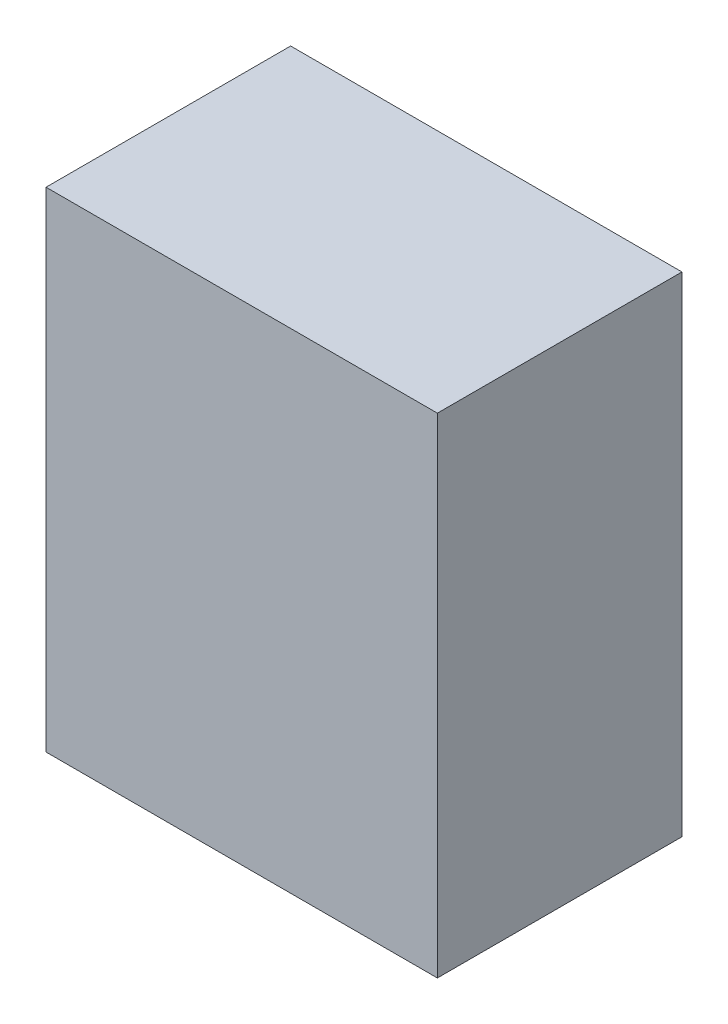
ISO-10303-21;
HEADER;
FILE_DESCRIPTION(('STEP AP214'),'2;1');
FILE_NAME('part.step','',(''),(''),'','','');
FILE_SCHEMA(('AUTOMOTIVE_DESIGN { 1 0 10303 214 1 1 1 1 }'));
ENDSEC;
DATA;
#1=APPLICATION_CONTEXT('core data for automotive mechanical design processes');
#2=APPLICATION_PROTOCOL_DEFINITION('international standard','automotive_design',2000,#1);
#3=PRODUCT_CONTEXT('',#1,'mechanical');
#4=PRODUCT('Part','Part','',(#3));
#5=PRODUCT_RELATED_PRODUCT_CATEGORY('part','',(#4));
#6=PRODUCT_DEFINITION_FORMATION('','',#4);
#7=PRODUCT_DEFINITION_CONTEXT('part definition',#1,'design');
#8=PRODUCT_DEFINITION('design','',#6,#7);
#9=PRODUCT_DEFINITION_SHAPE('','',#8);
#10=(LENGTH_UNIT() NAMED_UNIT(*) SI_UNIT(.MILLI.,.METRE.));
#11=(NAMED_UNIT(*) PLANE_ANGLE_UNIT() SI_UNIT($,.RADIAN.));
#12=(NAMED_UNIT(*) SI_UNIT($,.STERADIAN.) SOLID_ANGLE_UNIT());
#13=UNCERTAINTY_MEASURE_WITH_UNIT(LENGTH_MEASURE(1.E-05),#10,'distance_accuracy_value','');
#14=(GEOMETRIC_REPRESENTATION_CONTEXT(3) GLOBAL_UNCERTAINTY_ASSIGNED_CONTEXT((#13)) GLOBAL_UNIT_ASSIGNED_CONTEXT((#10,
#11,#12)) REPRESENTATION_CONTEXT('',''));
#15=CARTESIAN_POINT('',(0.,0.,0.));
#16=DIRECTION('',(0.,0.,1.));
#17=DIRECTION('',(1.,0.,0.));
#18=AXIS2_PLACEMENT_3D('',#15,#16,#17);
#19=CARTESIAN_POINT('',(0.80000348,1.00000308,1.00000054));
#20=DIRECTION('',(0.,0.,-1.));
#21=DIRECTION('',(0.,-1.,0.));
#22=AXIS2_PLACEMENT_3D('',#19,#20,#21);
#23=PLANE('',#22);
#24=DIRECTION('',(-0.99999999999496,-3.17499123419987E-06,0.));
#25=VECTOR('',#24,1.);
#26=CARTESIAN_POINT('',(0.80000348,1.00000308,1.00000054));
#27=LINE('',#26,#25);
#28=CARTESIAN_POINT('',(0.80000348,1.00000308,1.00000054));
#29=VERTEX_POINT('',#28);
#30=CARTESIAN_POINT('',(-0.80000094,0.999998,1.00000054));
#31=VERTEX_POINT('',#30);
#32=EDGE_CURVE('E83',#29,#31,#27,.T.);
#33=ORIENTED_EDGE('',*,*,#32,.T.);
#34=DIRECTION('',(0.,-1.,0.));
#35=VECTOR('',#34,1.);
#36=CARTESIAN_POINT('',(-0.80000094,0.999998,1.00000054));
#37=LINE('',#36,#35);
#38=CARTESIAN_POINT('',(-0.80000094,-1.00000054,1.00000054));
#39=VERTEX_POINT('',#38);
#40=EDGE_CURVE('E101',#31,#39,#37,.T.);
#41=ORIENTED_EDGE('',*,*,#40,.T.);
#42=DIRECTION('',(0.99999999999874,1.58749561266459E-06,0.));
#43=VECTOR('',#42,1.);
#44=CARTESIAN_POINT('',(-0.80000094,-1.00000054,1.00000054));
#45=LINE('',#44,#43);
#46=CARTESIAN_POINT('',(0.80000348,-0.999998,1.00000054));
#47=VERTEX_POINT('',#46);
#48=EDGE_CURVE('E76',#39,#47,#45,.T.);
#49=ORIENTED_EDGE('',*,*,#48,.T.);
#50=DIRECTION('',(0.,1.,0.));
#51=VECTOR('',#50,1.);
#52=CARTESIAN_POINT('',(0.80000348,-0.999998,1.00000054));
#53=LINE('',#52,#51);
#54=EDGE_CURVE('E11',#47,#29,#53,.T.);
#55=ORIENTED_EDGE('',*,*,#54,.T.);
#56=EDGE_LOOP('',(#33,#41,#49,#55));
#57=FACE_BOUND('',#56,.T.);
#58=ADVANCED_FACE('F17',(#57),#23,.F.);
#59=CARTESIAN_POINT('',(0.80000348,1.00000308,0.));
#60=DIRECTION('',(0.,0.,-1.));
#61=DIRECTION('',(0.,-1.,0.));
#62=AXIS2_PLACEMENT_3D('',#59,#60,#61);
#63=PLANE('',#62);
#64=DIRECTION('',(0.,1.,0.));
#65=VECTOR('',#64,1.);
#66=CARTESIAN_POINT('',(0.80000348,-0.999998,0.));
#67=LINE('',#66,#65);
#68=CARTESIAN_POINT('',(0.80000348,-0.999998,0.));
#69=VERTEX_POINT('',#68);
#70=CARTESIAN_POINT('',(0.80000348,1.00000308,0.));
#71=VERTEX_POINT('',#70);
#72=EDGE_CURVE('E21',#69,#71,#67,.T.);
#73=ORIENTED_EDGE('',*,*,#72,.F.);
#74=DIRECTION('',(0.99999999999874,1.58749561266459E-06,0.));
#75=VECTOR('',#74,1.);
#76=CARTESIAN_POINT('',(-0.80000094,-1.00000054,0.));
#77=LINE('',#76,#75);
#78=CARTESIAN_POINT('',(-0.80000094,-1.00000054,0.));
#79=VERTEX_POINT('',#78);
#80=EDGE_CURVE('E98',#79,#69,#77,.T.);
#81=ORIENTED_EDGE('',*,*,#80,.F.);
#82=DIRECTION('',(0.,-1.,0.));
#83=VECTOR('',#82,1.);
#84=CARTESIAN_POINT('',(-0.80000094,0.999998,0.));
#85=LINE('',#84,#83);
#86=CARTESIAN_POINT('',(-0.80000094,0.999998,0.));
#87=VERTEX_POINT('',#86);
#88=EDGE_CURVE('E85',#87,#79,#85,.T.);
#89=ORIENTED_EDGE('',*,*,#88,.F.);
#90=DIRECTION('',(-0.99999999999496,-3.17499123419987E-06,0.));
#91=VECTOR('',#90,1.);
#92=CARTESIAN_POINT('',(0.80000348,1.00000308,0.));
#93=LINE('',#92,#91);
#94=EDGE_CURVE('E81',#71,#87,#93,.T.);
#95=ORIENTED_EDGE('',*,*,#94,.F.);
#96=EDGE_LOOP('',(#73,#81,#89,#95));
#97=FACE_BOUND('',#96,.T.);
#98=ADVANCED_FACE('F19',(#97),#63,.T.);
#99=CARTESIAN_POINT('',(0.80000348,-0.999998,0.));
#100=DIRECTION('',(-1.,0.,0.));
#101=DIRECTION('',(0.,0.,1.));
#102=AXIS2_PLACEMENT_3D('',#99,#100,#101);
#103=PLANE('',#102);
#104=ORIENTED_EDGE('',*,*,#72,.T.);
#105=DIRECTION('',(0.,0.,1.));
#106=VECTOR('',#105,1.);
#107=CARTESIAN_POINT('',(0.80000348,1.00000308,0.));
#108=LINE('',#107,#106);
#109=EDGE_CURVE('E70',#71,#29,#108,.T.);
#110=ORIENTED_EDGE('',*,*,#109,.T.);
#111=ORIENTED_EDGE('',*,*,#54,.F.);
#112=DIRECTION('',(0.,0.,1.));
#113=VECTOR('',#112,1.);
#114=CARTESIAN_POINT('',(0.80000348,-0.999998,0.));
#115=LINE('',#114,#113);
#116=EDGE_CURVE('E73',#69,#47,#115,.T.);
#117=ORIENTED_EDGE('',*,*,#116,.F.);
#118=EDGE_LOOP('',(#104,#110,#111,#117));
#119=FACE_BOUND('',#118,.T.);
#120=ADVANCED_FACE('F69',(#119),#103,.F.);
#121=CARTESIAN_POINT('',(-0.80000094,-1.00000054,0.));
#122=DIRECTION('',(-1.58749561266459E-06,0.99999999999874,0.));
#123=DIRECTION('',(0.,0.,1.));
#124=AXIS2_PLACEMENT_3D('',#121,#122,#123);
#125=PLANE('',#124);
#126=ORIENTED_EDGE('',*,*,#80,.T.);
#127=ORIENTED_EDGE('',*,*,#116,.T.);
#128=ORIENTED_EDGE('',*,*,#48,.F.);
#129=DIRECTION('',(0.,0.,1.));
#130=VECTOR('',#129,1.);
#131=CARTESIAN_POINT('',(-0.80000094,-1.00000054,0.));
#132=LINE('',#131,#130);
#133=EDGE_CURVE('E105',#79,#39,#132,.T.);
#134=ORIENTED_EDGE('',*,*,#133,.F.);
#135=EDGE_LOOP('',(#126,#127,#128,#134));
#136=FACE_BOUND('',#135,.T.);
#137=ADVANCED_FACE('F120',(#136),#125,.F.);
#138=CARTESIAN_POINT('',(-0.80000094,0.999998,0.));
#139=DIRECTION('',(1.,0.,0.));
#140=DIRECTION('',(0.,1.,0.));
#141=AXIS2_PLACEMENT_3D('',#138,#139,#140);
#142=PLANE('',#141);
#143=ORIENTED_EDGE('',*,*,#88,.T.);
#144=ORIENTED_EDGE('',*,*,#133,.T.);
#145=ORIENTED_EDGE('',*,*,#40,.F.);
#146=DIRECTION('',(0.,0.,1.));
#147=VECTOR('',#146,1.);
#148=CARTESIAN_POINT('',(-0.80000094,0.999998,0.));
#149=LINE('',#148,#147);
#150=EDGE_CURVE('E90',#87,#31,#149,.T.);
#151=ORIENTED_EDGE('',*,*,#150,.F.);
#152=EDGE_LOOP('',(#143,#144,#145,#151));
#153=FACE_BOUND('',#152,.T.);
#154=ADVANCED_FACE('F122',(#153),#142,.F.);
#155=CARTESIAN_POINT('',(0.80000348,1.00000308,0.));
#156=DIRECTION('',(3.17499123419987E-06,-0.99999999999496,0.));
#157=DIRECTION('',(0.,0.,-1.));
#158=AXIS2_PLACEMENT_3D('',#155,#156,#157);
#159=PLANE('',#158);
#160=ORIENTED_EDGE('',*,*,#94,.T.);
#161=ORIENTED_EDGE('',*,*,#150,.T.);
#162=ORIENTED_EDGE('',*,*,#32,.F.);
#163=ORIENTED_EDGE('',*,*,#109,.F.);
#164=EDGE_LOOP('',(#160,#161,#162,#163));
#165=FACE_BOUND('',#164,.T.);
#166=ADVANCED_FACE('F79',(#165),#159,.F.);
#167=CLOSED_SHELL('',(#58,#98,#120,#137,#154,#166));
#168=MANIFOLD_SOLID_BREP('B1',#167);
#169=ADVANCED_BREP_SHAPE_REPRESENTATION('',(#18,#168),#14);
#170=SHAPE_DEFINITION_REPRESENTATION(#9,#169);
ENDSEC;
END-ISO-10303-21;
